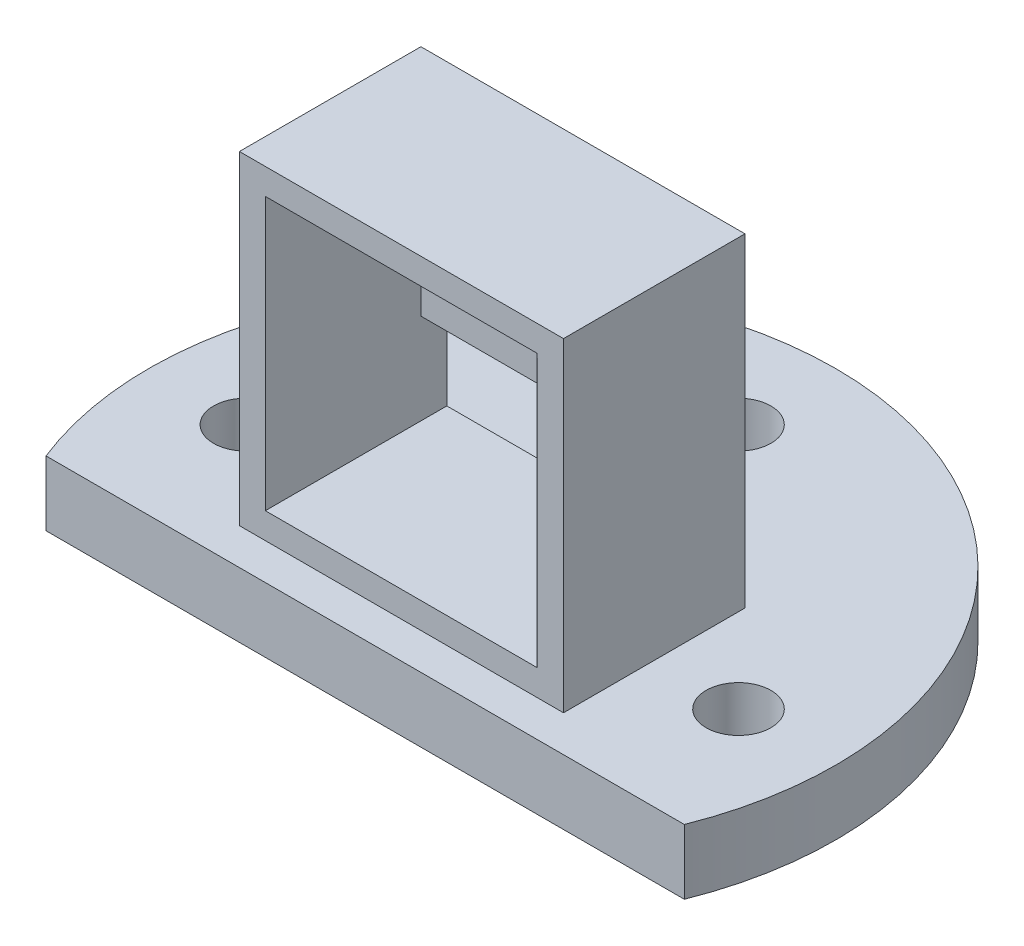
ISO-10303-21;
HEADER;
FILE_DESCRIPTION(('STEP AP214'),'2;1');
FILE_NAME('part.step','',(''),(''),'','','');
FILE_SCHEMA(('AUTOMOTIVE_DESIGN { 1 0 10303 214 1 1 1 1 }'));
ENDSEC;
DATA;
#1=APPLICATION_CONTEXT('core data for automotive mechanical design processes');
#2=APPLICATION_PROTOCOL_DEFINITION('international standard','automotive_design',2000,#1);
#3=PRODUCT_CONTEXT('',#1,'mechanical');
#4=PRODUCT('Part','Part','',(#3));
#5=PRODUCT_RELATED_PRODUCT_CATEGORY('part','',(#4));
#6=PRODUCT_DEFINITION_FORMATION('','',#4);
#7=PRODUCT_DEFINITION_CONTEXT('part definition',#1,'design');
#8=PRODUCT_DEFINITION('design','',#6,#7);
#9=PRODUCT_DEFINITION_SHAPE('','',#8);
#10=(LENGTH_UNIT() NAMED_UNIT(*) SI_UNIT(.MILLI.,.METRE.));
#11=(NAMED_UNIT(*) PLANE_ANGLE_UNIT() SI_UNIT($,.RADIAN.));
#12=(NAMED_UNIT(*) SI_UNIT($,.STERADIAN.) SOLID_ANGLE_UNIT());
#13=UNCERTAINTY_MEASURE_WITH_UNIT(LENGTH_MEASURE(1.E-05),#10,'distance_accuracy_value','');
#14=(GEOMETRIC_REPRESENTATION_CONTEXT(3) GLOBAL_UNCERTAINTY_ASSIGNED_CONTEXT((#13)) GLOBAL_UNIT_ASSIGNED_CONTEXT((#10,
#11,#12)) REPRESENTATION_CONTEXT('',''));
#15=CARTESIAN_POINT('',(0.,0.,0.));
#16=DIRECTION('',(0.,0.,1.));
#17=DIRECTION('',(1.,0.,0.));
#18=AXIS2_PLACEMENT_3D('',#15,#16,#17);
#19=CARTESIAN_POINT('',(-21.,56.,-10.));
#20=DIRECTION('',(0.,-1.,0.));
#21=DIRECTION('',(0.,0.,-1.));
#22=AXIS2_PLACEMENT_3D('',#19,#20,#21);
#23=PLANE('',#22);
#24=DIRECTION('',(1.,0.,0.));
#25=VECTOR('',#24,1.);
#26=CARTESIAN_POINT('',(-21.,56.,-10.));
#27=LINE('',#26,#25);
#28=CARTESIAN_POINT('',(20.8928650879154,56.,-10.));
#29=VERTEX_POINT('',#28);
#30=CARTESIAN_POINT('',(21.,56.,-10.));
#31=VERTEX_POINT('',#30);
#32=EDGE_CURVE('E84',#29,#31,#27,.T.);
#33=ORIENTED_EDGE('',*,*,#32,.F.);
#34=DIRECTION('',(0.,0.,1.));
#35=VECTOR('',#34,1.);
#36=CARTESIAN_POINT('',(20.8928650879154,56.,-10.));
#37=LINE('',#36,#35);
#38=CARTESIAN_POINT('',(20.8928650879154,56.,14.));
#39=VERTEX_POINT('',#38);
#40=EDGE_CURVE('E94',#29,#39,#37,.T.);
#41=ORIENTED_EDGE('',*,*,#40,.T.);
#42=DIRECTION('',(1.,0.,0.));
#43=VECTOR('',#42,1.);
#44=CARTESIAN_POINT('',(-21.,56.,14.));
#45=LINE('',#44,#43);
#46=CARTESIAN_POINT('',(21.,56.,14.));
#47=VERTEX_POINT('',#46);
#48=EDGE_CURVE('E92',#39,#47,#45,.T.);
#49=ORIENTED_EDGE('',*,*,#48,.T.);
#50=DIRECTION('',(0.,0.,1.));
#51=VECTOR('',#50,1.);
#52=CARTESIAN_POINT('',(21.,56.,-10.));
#53=LINE('',#52,#51);
#54=EDGE_CURVE('E12',#31,#47,#53,.T.);
#55=ORIENTED_EDGE('',*,*,#54,.F.);
#56=EDGE_LOOP('',(#33,#41,#49,#55));
#57=FACE_BOUND('',#56,.T.);
#58=ADVANCED_FACE('F42',(#57),#23,.F.);
#59=CARTESIAN_POINT('',(21.,14.,-10.));
#60=DIRECTION('',(1.,0.,0.));
#61=DIRECTION('',(0.,0.,-1.));
#62=AXIS2_PLACEMENT_3D('',#59,#60,#61);
#63=PLANE('',#62);
#64=DIRECTION('',(0.,1.,0.));
#65=VECTOR('',#64,1.);
#66=CARTESIAN_POINT('',(21.,14.,14.));
#67=LINE('',#66,#65);
#68=CARTESIAN_POINT('',(21.,14.,14.));
#69=VERTEX_POINT('',#68);
#70=EDGE_CURVE('E82',#69,#47,#67,.T.);
#71=ORIENTED_EDGE('',*,*,#70,.F.);
#72=DIRECTION('',(0.,0.,1.));
#73=VECTOR('',#72,1.);
#74=CARTESIAN_POINT('',(21.,14.,-10.));
#75=LINE('',#74,#73);
#76=CARTESIAN_POINT('',(21.,14.,-10.));
#77=VERTEX_POINT('',#76);
#78=EDGE_CURVE('E49',#77,#69,#75,.T.);
#79=ORIENTED_EDGE('',*,*,#78,.F.);
#80=DIRECTION('',(0.,1.,0.));
#81=VECTOR('',#80,1.);
#82=CARTESIAN_POINT('',(21.,14.,-10.));
#83=LINE('',#82,#81);
#84=EDGE_CURVE('E98',#77,#31,#83,.T.);
#85=ORIENTED_EDGE('',*,*,#84,.T.);
#86=ORIENTED_EDGE('',*,*,#54,.T.);
#87=EDGE_LOOP('',(#71,#79,#85,#86));
#88=FACE_BOUND('',#87,.T.);
#89=ADVANCED_FACE('F90',(#88),#63,.T.);
#90=CARTESIAN_POINT('',(-21.,14.,-10.));
#91=DIRECTION('',(0.,-1.,0.));
#92=DIRECTION('',(0.,0.,-1.));
#93=AXIS2_PLACEMENT_3D('',#90,#91,#92);
#94=PLANE('',#93);
#95=DIRECTION('',(0.,0.,1.));
#96=VECTOR('',#95,1.);
#97=CARTESIAN_POINT('',(20.8928650879154,14.,-10.));
#98=LINE('',#97,#96);
#99=CARTESIAN_POINT('',(20.8928650879154,14.,-10.));
#100=VERTEX_POINT('',#99);
#101=CARTESIAN_POINT('',(20.8928650879154,14.,14.));
#102=VERTEX_POINT('',#101);
#103=EDGE_CURVE('E56',#100,#102,#98,.T.);
#104=ORIENTED_EDGE('',*,*,#103,.F.);
#105=DIRECTION('',(1.,0.,0.));
#106=VECTOR('',#105,1.);
#107=CARTESIAN_POINT('',(-21.,14.,-10.));
#108=LINE('',#107,#106);
#109=EDGE_CURVE('E64',#100,#77,#108,.T.);
#110=ORIENTED_EDGE('',*,*,#109,.T.);
#111=ORIENTED_EDGE('',*,*,#78,.T.);
#112=DIRECTION('',(1.,0.,0.));
#113=VECTOR('',#112,1.);
#114=CARTESIAN_POINT('',(-21.,14.,14.));
#115=LINE('',#114,#113);
#116=EDGE_CURVE('E78',#102,#69,#115,.T.);
#117=ORIENTED_EDGE('',*,*,#116,.F.);
#118=EDGE_LOOP('',(#104,#110,#111,#117));
#119=FACE_BOUND('',#118,.T.);
#120=ADVANCED_FACE('F86',(#119),#94,.T.);
#121=CARTESIAN_POINT('',(0.,0.,-10.));
#122=DIRECTION('',(0.,0.,1.));
#123=DIRECTION('',(1.,0.,0.));
#124=AXIS2_PLACEMENT_3D('',#121,#122,#123);
#125=PLANE('',#124);
#126=ORIENTED_EDGE('',*,*,#109,.F.);
#127=DIRECTION('',(0.,1.,0.));
#128=VECTOR('',#127,1.);
#129=CARTESIAN_POINT('',(20.8928650879154,56.,-10.));
#130=LINE('',#129,#128);
#131=EDGE_CURVE('E102',#100,#29,#130,.T.);
#132=ORIENTED_EDGE('',*,*,#131,.T.);
#133=ORIENTED_EDGE('',*,*,#32,.T.);
#134=ORIENTED_EDGE('',*,*,#84,.F.);
#135=EDGE_LOOP('',(#126,#132,#133,#134));
#136=FACE_BOUND('',#135,.T.);
#137=ADVANCED_FACE('F109',(#136),#125,.F.);
#138=CARTESIAN_POINT('',(0.,0.,14.));
#139=DIRECTION('',(0.,0.,1.));
#140=DIRECTION('',(1.,0.,0.));
#141=AXIS2_PLACEMENT_3D('',#138,#139,#140);
#142=PLANE('',#141);
#143=DIRECTION('',(0.,1.,0.));
#144=VECTOR('',#143,1.);
#145=CARTESIAN_POINT('',(20.8928650879154,56.,14.));
#146=LINE('',#145,#144);
#147=EDGE_CURVE('E83',#102,#39,#146,.T.);
#148=ORIENTED_EDGE('',*,*,#147,.F.);
#149=ORIENTED_EDGE('',*,*,#116,.T.);
#150=ORIENTED_EDGE('',*,*,#70,.T.);
#151=ORIENTED_EDGE('',*,*,#48,.F.);
#152=EDGE_LOOP('',(#148,#149,#150,#151));
#153=FACE_BOUND('',#152,.T.);
#154=ADVANCED_FACE('F79',(#153),#142,.T.);
#155=CARTESIAN_POINT('',(20.8928650879154,56.,-10.));
#156=DIRECTION('',(1.,0.,0.));
#157=DIRECTION('',(0.,1.,0.));
#158=AXIS2_PLACEMENT_3D('',#155,#156,#157);
#159=PLANE('',#158);
#160=ORIENTED_EDGE('',*,*,#147,.T.);
#161=ORIENTED_EDGE('',*,*,#40,.F.);
#162=ORIENTED_EDGE('',*,*,#131,.F.);
#163=ORIENTED_EDGE('',*,*,#103,.T.);
#164=EDGE_LOOP('',(#160,#161,#162,#163));
#165=FACE_BOUND('',#164,.T.);
#166=ADVANCED_FACE('F113',(#165),#159,.F.);
#167=CLOSED_SHELL('',(#58,#89,#120,#137,#154,#166));
#168=MANIFOLD_SOLID_BREP('B2',#167);
#169=CARTESIAN_POINT('',(0.,10.,0.));
#170=DIRECTION('',(0.,1.,0.));
#171=DIRECTION('',(0.,0.,1.));
#172=AXIS2_PLACEMENT_3D('',#169,#170,#171);
#173=PLANE('',#172);
#174=DIRECTION('',(1.,0.,0.));
#175=VECTOR('',#174,1.);
#176=CARTESIAN_POINT('',(-25.,10.,-14.));
#177=LINE('',#176,#175);
#178=CARTESIAN_POINT('',(-25.,10.,-14.));
#179=VERTEX_POINT('',#178);
#180=CARTESIAN_POINT('',(25.,10.,-14.));
#181=VERTEX_POINT('',#180);
#182=EDGE_CURVE('E330',#179,#181,#177,.T.);
#183=ORIENTED_EDGE('',*,*,#182,.T.);
#184=DIRECTION('',(0.,0.,-1.));
#185=VECTOR('',#184,1.);
#186=CARTESIAN_POINT('',(25.,10.,14.));
#187=LINE('',#186,#185);
#188=CARTESIAN_POINT('',(25.,10.,14.));
#189=VERTEX_POINT('',#188);
#190=EDGE_CURVE('E348',#189,#181,#187,.T.);
#191=ORIENTED_EDGE('',*,*,#190,.F.);
#192=DIRECTION('',(1.,0.,0.));
#193=VECTOR('',#192,1.);
#194=CARTESIAN_POINT('',(-25.,10.,14.));
#195=LINE('',#194,#193);
#196=CARTESIAN_POINT('',(-25.,10.,14.));
#197=VERTEX_POINT('',#196);
#198=EDGE_CURVE('E351',#197,#189,#195,.T.);
#199=ORIENTED_EDGE('',*,*,#198,.F.);
#200=DIRECTION('',(0.,0.,-1.));
#201=VECTOR('',#200,1.);
#202=CARTESIAN_POINT('',(-25.,10.,14.));
#203=LINE('',#202,#201);
#204=EDGE_CURVE('E338',#197,#179,#203,.T.);
#205=ORIENTED_EDGE('',*,*,#204,.T.);
#206=EDGE_LOOP('',(#183,#191,#199,#205));
#207=FACE_BOUND('',#206,.T.);
#208=CARTESIAN_POINT('',(38.,10.,0.));
#209=DIRECTION('',(0.,1.,0.));
#210=DIRECTION('',(0.,0.,1.));
#211=AXIS2_PLACEMENT_3D('',#208,#209,#210);
#212=CIRCLE('',#211,5.);
#213=CARTESIAN_POINT('',(38.,10.,5.));
#214=VERTEX_POINT('',#213);
#215=EDGE_CURVE('E370',#214,#214,#212,.T.);
#216=ORIENTED_EDGE('',*,*,#215,.F.);
#217=EDGE_LOOP('',(#216));
#218=FACE_BOUND('',#217,.T.);
#219=CARTESIAN_POINT('',(0.,10.,0.));
#220=DIRECTION('',(0.,1.,0.));
#221=DIRECTION('',(0.,0.,1.));
#222=AXIS2_PLACEMENT_3D('',#219,#220,#221);
#223=CIRCLE('',#222,53.);
#224=CARTESIAN_POINT('',(49.2428543082641,10.,19.5995229425382));
#225=VERTEX_POINT('',#224);
#226=CARTESIAN_POINT('',(-49.2428543082641,10.,19.5995229425382));
#227=VERTEX_POINT('',#226);
#228=EDGE_CURVE('E382',#225,#227,#223,.T.);
#229=ORIENTED_EDGE('',*,*,#228,.T.);
#230=DIRECTION('',(1.,0.,0.));
#231=VECTOR('',#230,1.);
#232=CARTESIAN_POINT('',(-49.2428543082641,10.,19.5995229425382));
#233=LINE('',#232,#231);
#234=EDGE_CURVE('E385',#227,#225,#233,.T.);
#235=ORIENTED_EDGE('',*,*,#234,.T.);
#236=EDGE_LOOP('',(#229,#235));
#237=FACE_BOUND('',#236,.T.);
#238=CARTESIAN_POINT('',(-38.,10.,0.));
#239=DIRECTION('',(0.,1.,0.));
#240=DIRECTION('',(0.,0.,1.));
#241=AXIS2_PLACEMENT_3D('',#238,#239,#240);
#242=CIRCLE('',#241,5.);
#243=CARTESIAN_POINT('',(-38.,10.,5.));
#244=VERTEX_POINT('',#243);
#245=EDGE_CURVE('E376',#244,#244,#242,.T.);
#246=ORIENTED_EDGE('',*,*,#245,.F.);
#247=EDGE_LOOP('',(#246));
#248=FACE_BOUND('',#247,.T.);
#249=CARTESIAN_POINT('',(0.,10.,-38.));
#250=DIRECTION('',(0.,1.,0.));
#251=DIRECTION('',(0.,0.,1.));
#252=AXIS2_PLACEMENT_3D('',#249,#250,#251);
#253=CIRCLE('',#252,5.);
#254=CARTESIAN_POINT('',(0.,10.,-33.));
#255=VERTEX_POINT('',#254);
#256=EDGE_CURVE('E364',#255,#255,#253,.T.);
#257=ORIENTED_EDGE('',*,*,#256,.F.);
#258=EDGE_LOOP('',(#257));
#259=FACE_BOUND('',#258,.T.);
#260=ADVANCED_FACE('F162',(#207,#218,#237,#248,#259),#173,.T.);
#261=CARTESIAN_POINT('',(0.,0.,0.));
#262=DIRECTION('',(0.,1.,0.));
#263=DIRECTION('',(0.,0.,1.));
#264=AXIS2_PLACEMENT_3D('',#261,#262,#263);
#265=PLANE('',#264);
#266=CARTESIAN_POINT('',(0.,0.,0.));
#267=DIRECTION('',(0.,1.,0.));
#268=DIRECTION('',(0.,0.,1.));
#269=AXIS2_PLACEMENT_3D('',#266,#267,#268);
#270=CIRCLE('',#269,53.);
#271=CARTESIAN_POINT('',(49.2428543082641,0.,19.5995229425382));
#272=VERTEX_POINT('',#271);
#273=CARTESIAN_POINT('',(-49.2428543082641,0.,19.5995229425382));
#274=VERTEX_POINT('',#273);
#275=EDGE_CURVE('E379',#272,#274,#270,.T.);
#276=ORIENTED_EDGE('',*,*,#275,.F.);
#277=DIRECTION('',(1.,0.,0.));
#278=VECTOR('',#277,1.);
#279=CARTESIAN_POINT('',(-49.2428543082641,0.,19.5995229425382));
#280=LINE('',#279,#278);
#281=EDGE_CURVE('E386',#274,#272,#280,.T.);
#282=ORIENTED_EDGE('',*,*,#281,.F.);
#283=EDGE_LOOP('',(#276,#282));
#284=FACE_BOUND('',#283,.T.);
#285=CARTESIAN_POINT('',(-38.,0.,0.));
#286=DIRECTION('',(0.,1.,0.));
#287=DIRECTION('',(0.,0.,1.));
#288=AXIS2_PLACEMENT_3D('',#285,#286,#287);
#289=CIRCLE('',#288,5.);
#290=CARTESIAN_POINT('',(-38.,0.,5.));
#291=VERTEX_POINT('',#290);
#292=EDGE_CURVE('E373',#291,#291,#289,.T.);
#293=ORIENTED_EDGE('',*,*,#292,.T.);
#294=EDGE_LOOP('',(#293));
#295=FACE_BOUND('',#294,.T.);
#296=CARTESIAN_POINT('',(38.,0.,0.));
#297=DIRECTION('',(0.,1.,0.));
#298=DIRECTION('',(0.,0.,1.));
#299=AXIS2_PLACEMENT_3D('',#296,#297,#298);
#300=CIRCLE('',#299,5.);
#301=CARTESIAN_POINT('',(38.,0.,5.));
#302=VERTEX_POINT('',#301);
#303=EDGE_CURVE('E367',#302,#302,#300,.T.);
#304=ORIENTED_EDGE('',*,*,#303,.T.);
#305=EDGE_LOOP('',(#304));
#306=FACE_BOUND('',#305,.T.);
#307=CARTESIAN_POINT('',(0.,0.,-38.));
#308=DIRECTION('',(0.,1.,0.));
#309=DIRECTION('',(0.,0.,1.));
#310=AXIS2_PLACEMENT_3D('',#307,#308,#309);
#311=CIRCLE('',#310,5.);
#312=CARTESIAN_POINT('',(0.,0.,-33.));
#313=VERTEX_POINT('',#312);
#314=EDGE_CURVE('E358',#313,#313,#311,.T.);
#315=ORIENTED_EDGE('',*,*,#314,.T.);
#316=EDGE_LOOP('',(#315));
#317=FACE_BOUND('',#316,.T.);
#318=ADVANCED_FACE('F398',(#284,#295,#306,#317),#265,.F.);
#319=CARTESIAN_POINT('',(0.,10.,0.));
#320=DIRECTION('',(0.,-1.,0.));
#321=DIRECTION('',(0.,0.,-1.));
#322=AXIS2_PLACEMENT_3D('',#319,#320,#321);
#323=CYLINDRICAL_SURFACE('',#322,53.);
#324=ORIENTED_EDGE('',*,*,#275,.T.);
#325=DIRECTION('',(0.,-1.,0.));
#326=VECTOR('',#325,1.);
#327=CARTESIAN_POINT('',(-49.2428543082641,10.,19.5995229425382));
#328=LINE('',#327,#326);
#329=EDGE_CURVE('E40',#227,#274,#328,.T.);
#330=ORIENTED_EDGE('',*,*,#329,.F.);
#331=ORIENTED_EDGE('',*,*,#228,.F.);
#332=DIRECTION('',(0.,-1.,0.));
#333=VECTOR('',#332,1.);
#334=CARTESIAN_POINT('',(49.2428543082641,10.,19.5995229425382));
#335=LINE('',#334,#333);
#336=EDGE_CURVE('E170',#225,#272,#335,.T.);
#337=ORIENTED_EDGE('',*,*,#336,.T.);
#338=EDGE_LOOP('',(#324,#330,#331,#337));
#339=FACE_BOUND('',#338,.T.);
#340=ADVANCED_FACE('F164',(#339),#323,.T.);
#341=CARTESIAN_POINT('',(-49.2428543082641,10.,19.5995229425382));
#342=DIRECTION('',(0.,0.,-1.));
#343=DIRECTION('',(-1.,0.,0.));
#344=AXIS2_PLACEMENT_3D('',#341,#342,#343);
#345=PLANE('',#344);
#346=ORIENTED_EDGE('',*,*,#281,.T.);
#347=ORIENTED_EDGE('',*,*,#336,.F.);
#348=ORIENTED_EDGE('',*,*,#234,.F.);
#349=ORIENTED_EDGE('',*,*,#329,.T.);
#350=EDGE_LOOP('',(#346,#347,#348,#349));
#351=FACE_BOUND('',#350,.T.);
#352=ADVANCED_FACE('F400',(#351),#345,.F.);
#353=CARTESIAN_POINT('',(-38.,10.,0.));
#354=DIRECTION('',(0.,-1.,0.));
#355=DIRECTION('',(0.,0.,-1.));
#356=AXIS2_PLACEMENT_3D('',#353,#354,#355);
#357=CYLINDRICAL_SURFACE('',#356,5.);
#358=ORIENTED_EDGE('',*,*,#245,.T.);
#359=EDGE_LOOP('',(#358));
#360=FACE_BOUND('',#359,.T.);
#361=ORIENTED_EDGE('',*,*,#292,.F.);
#362=EDGE_LOOP('',(#361));
#363=FACE_BOUND('',#362,.T.);
#364=ADVANCED_FACE('F424',(#360,#363),#357,.F.);
#365=CARTESIAN_POINT('',(38.,10.,0.));
#366=DIRECTION('',(0.,-1.,0.));
#367=DIRECTION('',(0.,0.,-1.));
#368=AXIS2_PLACEMENT_3D('',#365,#366,#367);
#369=CYLINDRICAL_SURFACE('',#368,5.);
#370=ORIENTED_EDGE('',*,*,#215,.T.);
#371=EDGE_LOOP('',(#370));
#372=FACE_BOUND('',#371,.T.);
#373=ORIENTED_EDGE('',*,*,#303,.F.);
#374=EDGE_LOOP('',(#373));
#375=FACE_BOUND('',#374,.T.);
#376=ADVANCED_FACE('F413',(#372,#375),#369,.F.);
#377=CARTESIAN_POINT('',(0.,10.,-38.));
#378=DIRECTION('',(0.,-1.,0.));
#379=DIRECTION('',(0.,0.,-1.));
#380=AXIS2_PLACEMENT_3D('',#377,#378,#379);
#381=CYLINDRICAL_SURFACE('',#380,5.);
#382=ORIENTED_EDGE('',*,*,#256,.T.);
#383=EDGE_LOOP('',(#382));
#384=FACE_BOUND('',#383,.T.);
#385=ORIENTED_EDGE('',*,*,#314,.F.);
#386=EDGE_LOOP('',(#385));
#387=FACE_BOUND('',#386,.T.);
#388=ADVANCED_FACE('F410',(#384,#387),#381,.F.);
#389=CARTESIAN_POINT('',(-25.,60.,-14.));
#390=DIRECTION('',(0.,0.,-1.));
#391=DIRECTION('',(-1.,0.,0.));
#392=AXIS2_PLACEMENT_3D('',#389,#390,#391);
#393=PLANE('',#392);
#394=DIRECTION('',(0.,-1.,0.));
#395=VECTOR('',#394,1.);
#396=CARTESIAN_POINT('',(-21.,14.,-14.));
#397=LINE('',#396,#395);
#398=CARTESIAN_POINT('',(-21.,28.,-14.));
#399=VERTEX_POINT('',#398);
#400=CARTESIAN_POINT('',(-21.,14.,-14.));
#401=VERTEX_POINT('',#400);
#402=EDGE_CURVE('E268',#399,#401,#397,.T.);
#403=ORIENTED_EDGE('',*,*,#402,.T.);
#404=DIRECTION('',(1.,0.,0.));
#405=VECTOR('',#404,1.);
#406=CARTESIAN_POINT('',(-21.,14.,-14.));
#407=LINE('',#406,#405);
#408=CARTESIAN_POINT('',(20.8928650879154,14.,-14.));
#409=VERTEX_POINT('',#408);
#410=EDGE_CURVE('E276',#401,#409,#407,.T.);
#411=ORIENTED_EDGE('',*,*,#410,.T.);
#412=DIRECTION('',(0.,1.,0.));
#413=VECTOR('',#412,1.);
#414=CARTESIAN_POINT('',(20.8928650879154,14.,-14.));
#415=LINE('',#414,#413);
#416=CARTESIAN_POINT('',(20.8928650879154,28.,-14.));
#417=VERTEX_POINT('',#416);
#418=EDGE_CURVE('E280',#409,#417,#415,.T.);
#419=ORIENTED_EDGE('',*,*,#418,.T.);
#420=DIRECTION('',(-1.,0.,0.));
#421=VECTOR('',#420,1.);
#422=CARTESIAN_POINT('',(-21.,28.,-14.));
#423=LINE('',#422,#421);
#424=EDGE_CURVE('E285',#417,#399,#423,.T.);
#425=ORIENTED_EDGE('',*,*,#424,.T.);
#426=EDGE_LOOP('',(#403,#411,#419,#425));
#427=FACE_BOUND('',#426,.T.);
#428=DIRECTION('',(0.,-1.,0.));
#429=VECTOR('',#428,1.);
#430=CARTESIAN_POINT('',(-21.,44.,-14.));
#431=LINE('',#430,#429);
#432=CARTESIAN_POINT('',(-21.,56.,-14.));
#433=VERTEX_POINT('',#432);
#434=CARTESIAN_POINT('',(-21.,44.,-14.));
#435=VERTEX_POINT('',#434);
#436=EDGE_CURVE('E298',#433,#435,#431,.T.);
#437=ORIENTED_EDGE('',*,*,#436,.T.);
#438=DIRECTION('',(1.,0.,0.));
#439=VECTOR('',#438,1.);
#440=CARTESIAN_POINT('',(-21.,44.,-14.));
#441=LINE('',#440,#439);
#442=CARTESIAN_POINT('',(20.8928650879154,44.,-14.));
#443=VERTEX_POINT('',#442);
#444=EDGE_CURVE('E301',#435,#443,#441,.T.);
#445=ORIENTED_EDGE('',*,*,#444,.T.);
#446=DIRECTION('',(0.,1.,0.));
#447=VECTOR('',#446,1.);
#448=CARTESIAN_POINT('',(20.8928650879154,44.,-14.));
#449=LINE('',#448,#447);
#450=CARTESIAN_POINT('',(20.8928650879154,56.,-14.));
#451=VERTEX_POINT('',#450);
#452=EDGE_CURVE('E304',#443,#451,#449,.T.);
#453=ORIENTED_EDGE('',*,*,#452,.T.);
#454=DIRECTION('',(-1.,0.,0.));
#455=VECTOR('',#454,1.);
#456=CARTESIAN_POINT('',(-21.,56.,-14.));
#457=LINE('',#456,#455);
#458=EDGE_CURVE('E307',#451,#433,#457,.T.);
#459=ORIENTED_EDGE('',*,*,#458,.T.);
#460=EDGE_LOOP('',(#437,#445,#453,#459));
#461=FACE_BOUND('',#460,.T.);
#462=ORIENTED_EDGE('',*,*,#182,.F.);
#463=DIRECTION('',(0.,-1.,0.));
#464=VECTOR('',#463,1.);
#465=CARTESIAN_POINT('',(-25.,60.,-14.));
#466=LINE('',#465,#464);
#467=CARTESIAN_POINT('',(-25.,60.,-14.));
#468=VERTEX_POINT('',#467);
#469=EDGE_CURVE('E356',#468,#179,#466,.T.);
#470=ORIENTED_EDGE('',*,*,#469,.F.);
#471=DIRECTION('',(1.,0.,0.));
#472=VECTOR('',#471,1.);
#473=CARTESIAN_POINT('',(-25.,60.,-14.));
#474=LINE('',#473,#472);
#475=CARTESIAN_POINT('',(25.,60.,-14.));
#476=VERTEX_POINT('',#475);
#477=EDGE_CURVE('E334',#468,#476,#474,.T.);
#478=ORIENTED_EDGE('',*,*,#477,.T.);
#479=DIRECTION('',(0.,-1.,0.));
#480=VECTOR('',#479,1.);
#481=CARTESIAN_POINT('',(25.,60.,-14.));
#482=LINE('',#481,#480);
#483=EDGE_CURVE('E345',#476,#181,#482,.T.);
#484=ORIENTED_EDGE('',*,*,#483,.T.);
#485=EDGE_LOOP('',(#462,#470,#478,#484));
#486=FACE_BOUND('',#485,.T.);
#487=ADVANCED_FACE('F282',(#427,#461,#486),#393,.T.);
#488=CARTESIAN_POINT('',(-25.,60.,14.));
#489=DIRECTION('',(-1.,0.,0.));
#490=DIRECTION('',(0.,0.,1.));
#491=AXIS2_PLACEMENT_3D('',#488,#489,#490);
#492=PLANE('',#491);
#493=ORIENTED_EDGE('',*,*,#204,.F.);
#494=DIRECTION('',(0.,-1.,0.));
#495=VECTOR('',#494,1.);
#496=CARTESIAN_POINT('',(-25.,60.,14.));
#497=LINE('',#496,#495);
#498=CARTESIAN_POINT('',(-25.,60.,14.));
#499=VERTEX_POINT('',#498);
#500=EDGE_CURVE('E359',#499,#197,#497,.T.);
#501=ORIENTED_EDGE('',*,*,#500,.F.);
#502=DIRECTION('',(0.,0.,-1.));
#503=VECTOR('',#502,1.);
#504=CARTESIAN_POINT('',(-25.,60.,14.));
#505=LINE('',#504,#503);
#506=EDGE_CURVE('E342',#499,#468,#505,.T.);
#507=ORIENTED_EDGE('',*,*,#506,.T.);
#508=ORIENTED_EDGE('',*,*,#469,.T.);
#509=EDGE_LOOP('',(#493,#501,#507,#508));
#510=FACE_BOUND('',#509,.T.);
#511=ADVANCED_FACE('F438',(#510),#492,.T.);
#512=CARTESIAN_POINT('',(-25.,60.,14.));
#513=DIRECTION('',(0.,0.,-1.));
#514=DIRECTION('',(-1.,0.,0.));
#515=AXIS2_PLACEMENT_3D('',#512,#513,#514);
#516=PLANE('',#515);
#517=DIRECTION('',(1.,0.,0.));
#518=VECTOR('',#517,1.);
#519=CARTESIAN_POINT('',(-21.,14.,14.));
#520=LINE('',#519,#518);
#521=CARTESIAN_POINT('',(-21.,14.,14.));
#522=VERTEX_POINT('',#521);
#523=CARTESIAN_POINT('',(20.8928650879154,14.,14.));
#524=VERTEX_POINT('',#523);
#525=EDGE_CURVE('E321',#522,#524,#520,.T.);
#526=ORIENTED_EDGE('',*,*,#525,.F.);
#527=DIRECTION('',(0.,-1.,0.));
#528=VECTOR('',#527,1.);
#529=CARTESIAN_POINT('',(-21.,56.,14.));
#530=LINE('',#529,#528);
#531=CARTESIAN_POINT('',(-21.,56.,14.));
#532=VERTEX_POINT('',#531);
#533=EDGE_CURVE('E271',#532,#522,#530,.T.);
#534=ORIENTED_EDGE('',*,*,#533,.F.);
#535=DIRECTION('',(-1.,0.,0.));
#536=VECTOR('',#535,1.);
#537=CARTESIAN_POINT('',(-21.,56.,14.));
#538=LINE('',#537,#536);
#539=CARTESIAN_POINT('',(20.8928650879154,56.,14.));
#540=VERTEX_POINT('',#539);
#541=EDGE_CURVE('E318',#540,#532,#538,.T.);
#542=ORIENTED_EDGE('',*,*,#541,.F.);
#543=DIRECTION('',(0.,1.,0.));
#544=VECTOR('',#543,1.);
#545=CARTESIAN_POINT('',(20.8928650879154,56.,14.));
#546=LINE('',#545,#544);
#547=EDGE_CURVE('E323',#524,#540,#546,.T.);
#548=ORIENTED_EDGE('',*,*,#547,.F.);
#549=EDGE_LOOP('',(#526,#534,#542,#548));
#550=FACE_BOUND('',#549,.T.);
#551=ORIENTED_EDGE('',*,*,#198,.T.);
#552=DIRECTION('',(0.,-1.,0.));
#553=VECTOR('',#552,1.);
#554=CARTESIAN_POINT('',(25.,60.,14.));
#555=LINE('',#554,#553);
#556=CARTESIAN_POINT('',(25.,60.,14.));
#557=VERTEX_POINT('',#556);
#558=EDGE_CURVE('E361',#557,#189,#555,.T.);
#559=ORIENTED_EDGE('',*,*,#558,.F.);
#560=DIRECTION('',(1.,0.,0.));
#561=VECTOR('',#560,1.);
#562=CARTESIAN_POINT('',(-25.,60.,14.));
#563=LINE('',#562,#561);
#564=EDGE_CURVE('E340',#499,#557,#563,.T.);
#565=ORIENTED_EDGE('',*,*,#564,.F.);
#566=ORIENTED_EDGE('',*,*,#500,.T.);
#567=EDGE_LOOP('',(#551,#559,#565,#566));
#568=FACE_BOUND('',#567,.T.);
#569=ADVANCED_FACE('F443',(#550,#568),#516,.F.);
#570=CARTESIAN_POINT('',(25.,60.,14.));
#571=DIRECTION('',(-1.,0.,0.));
#572=DIRECTION('',(0.,0.,1.));
#573=AXIS2_PLACEMENT_3D('',#570,#571,#572);
#574=PLANE('',#573);
#575=ORIENTED_EDGE('',*,*,#190,.T.);
#576=ORIENTED_EDGE('',*,*,#483,.F.);
#577=DIRECTION('',(0.,0.,-1.));
#578=VECTOR('',#577,1.);
#579=CARTESIAN_POINT('',(25.,60.,14.));
#580=LINE('',#579,#578);
#581=EDGE_CURVE('E337',#557,#476,#580,.T.);
#582=ORIENTED_EDGE('',*,*,#581,.F.);
#583=ORIENTED_EDGE('',*,*,#558,.T.);
#584=EDGE_LOOP('',(#575,#576,#582,#583));
#585=FACE_BOUND('',#584,.T.);
#586=ADVANCED_FACE('F439',(#585),#574,.F.);
#587=CARTESIAN_POINT('',(0.,60.,0.));
#588=DIRECTION('',(0.,1.,0.));
#589=DIRECTION('',(0.,0.,1.));
#590=AXIS2_PLACEMENT_3D('',#587,#588,#589);
#591=PLANE('',#590);
#592=ORIENTED_EDGE('',*,*,#477,.F.);
#593=ORIENTED_EDGE('',*,*,#506,.F.);
#594=ORIENTED_EDGE('',*,*,#564,.T.);
#595=ORIENTED_EDGE('',*,*,#581,.T.);
#596=EDGE_LOOP('',(#592,#593,#594,#595));
#597=FACE_BOUND('',#596,.T.);
#598=ADVANCED_FACE('F442',(#597),#591,.T.);
#599=CARTESIAN_POINT('',(-21.,56.,-10.));
#600=DIRECTION('',(-1.,0.,0.));
#601=DIRECTION('',(0.,0.,1.));
#602=AXIS2_PLACEMENT_3D('',#599,#600,#601);
#603=PLANE('',#602);
#604=ORIENTED_EDGE('',*,*,#533,.T.);
#605=DIRECTION('',(0.,0.,1.));
#606=VECTOR('',#605,1.);
#607=CARTESIAN_POINT('',(-21.,14.,-10.));
#608=LINE('',#607,#606);
#609=EDGE_CURVE('E265',#401,#522,#608,.T.);
#610=ORIENTED_EDGE('',*,*,#609,.F.);
#611=ORIENTED_EDGE('',*,*,#402,.F.);
#612=DIRECTION('',(0.,0.,1.));
#613=VECTOR('',#612,1.);
#614=CARTESIAN_POINT('',(-21.,28.,-14.));
#615=LINE('',#614,#613);
#616=CARTESIAN_POINT('',(-21.,28.,-10.));
#617=VERTEX_POINT('',#616);
#618=EDGE_CURVE('E294',#399,#617,#615,.T.);
#619=ORIENTED_EDGE('',*,*,#618,.T.);
#620=DIRECTION('',(0.,-1.,0.));
#621=VECTOR('',#620,1.);
#622=CARTESIAN_POINT('',(-21.,56.,-10.));
#623=LINE('',#622,#621);
#624=CARTESIAN_POINT('',(-21.,44.,-10.));
#625=VERTEX_POINT('',#624);
#626=EDGE_CURVE('E315',#625,#617,#623,.T.);
#627=ORIENTED_EDGE('',*,*,#626,.F.);
#628=DIRECTION('',(0.,0.,1.));
#629=VECTOR('',#628,1.);
#630=CARTESIAN_POINT('',(-21.,44.,-14.));
#631=LINE('',#630,#629);
#632=EDGE_CURVE('E185',#435,#625,#631,.T.);
#633=ORIENTED_EDGE('',*,*,#632,.F.);
#634=ORIENTED_EDGE('',*,*,#436,.F.);
#635=DIRECTION('',(0.,0.,1.));
#636=VECTOR('',#635,1.);
#637=CARTESIAN_POINT('',(-21.,56.,-10.));
#638=LINE('',#637,#636);
#639=EDGE_CURVE('E328',#433,#532,#638,.T.);
#640=ORIENTED_EDGE('',*,*,#639,.T.);
#641=EDGE_LOOP('',(#604,#610,#611,#619,#627,#633,#634,#640));
#642=FACE_BOUND('',#641,.T.);
#643=ADVANCED_FACE('F266',(#642),#603,.F.);
#644=CARTESIAN_POINT('',(-21.,56.,-10.));
#645=DIRECTION('',(0.,1.,0.));
#646=DIRECTION('',(0.,0.,1.));
#647=AXIS2_PLACEMENT_3D('',#644,#645,#646);
#648=PLANE('',#647);
#649=ORIENTED_EDGE('',*,*,#541,.T.);
#650=ORIENTED_EDGE('',*,*,#639,.F.);
#651=ORIENTED_EDGE('',*,*,#458,.F.);
#652=DIRECTION('',(0.,0.,1.));
#653=VECTOR('',#652,1.);
#654=CARTESIAN_POINT('',(20.8928650879154,56.,-10.));
#655=LINE('',#654,#653);
#656=EDGE_CURVE('E331',#451,#540,#655,.T.);
#657=ORIENTED_EDGE('',*,*,#656,.T.);
#658=EDGE_LOOP('',(#649,#650,#651,#657));
#659=FACE_BOUND('',#658,.T.);
#660=ADVANCED_FACE('F456',(#659),#648,.F.);
#661=CARTESIAN_POINT('',(20.8928650879154,56.,-10.));
#662=DIRECTION('',(1.,0.,0.));
#663=DIRECTION('',(0.,1.,0.));
#664=AXIS2_PLACEMENT_3D('',#661,#662,#663);
#665=PLANE('',#664);
#666=ORIENTED_EDGE('',*,*,#547,.T.);
#667=ORIENTED_EDGE('',*,*,#656,.F.);
#668=ORIENTED_EDGE('',*,*,#452,.F.);
#669=DIRECTION('',(0.,0.,1.));
#670=VECTOR('',#669,1.);
#671=CARTESIAN_POINT('',(20.8928650879154,44.,-14.));
#672=LINE('',#671,#670);
#673=CARTESIAN_POINT('',(20.8928650879154,44.,-10.));
#674=VERTEX_POINT('',#673);
#675=EDGE_CURVE('E311',#443,#674,#672,.T.);
#676=ORIENTED_EDGE('',*,*,#675,.T.);
#677=DIRECTION('',(0.,1.,0.));
#678=VECTOR('',#677,1.);
#679=CARTESIAN_POINT('',(20.8928650879154,56.,-10.));
#680=LINE('',#679,#678);
#681=CARTESIAN_POINT('',(20.8928650879154,28.,-10.));
#682=VERTEX_POINT('',#681);
#683=EDGE_CURVE('E273',#682,#674,#680,.T.);
#684=ORIENTED_EDGE('',*,*,#683,.F.);
#685=DIRECTION('',(0.,0.,1.));
#686=VECTOR('',#685,1.);
#687=CARTESIAN_POINT('',(20.8928650879154,28.,-14.));
#688=LINE('',#687,#686);
#689=EDGE_CURVE('E292',#417,#682,#688,.T.);
#690=ORIENTED_EDGE('',*,*,#689,.F.);
#691=ORIENTED_EDGE('',*,*,#418,.F.);
#692=DIRECTION('',(0.,0.,1.));
#693=VECTOR('',#692,1.);
#694=CARTESIAN_POINT('',(20.8928650879154,14.,-10.));
#695=LINE('',#694,#693);
#696=EDGE_CURVE('E177',#409,#524,#695,.T.);
#697=ORIENTED_EDGE('',*,*,#696,.T.);
#698=EDGE_LOOP('',(#666,#667,#668,#676,#684,#690,#691,#697));
#699=FACE_BOUND('',#698,.T.);
#700=ADVANCED_FACE('F460',(#699),#665,.F.);
#701=CARTESIAN_POINT('',(-21.,14.,-10.));
#702=DIRECTION('',(0.,-1.,0.));
#703=DIRECTION('',(0.,0.,-1.));
#704=AXIS2_PLACEMENT_3D('',#701,#702,#703);
#705=PLANE('',#704);
#706=ORIENTED_EDGE('',*,*,#525,.T.);
#707=ORIENTED_EDGE('',*,*,#696,.F.);
#708=ORIENTED_EDGE('',*,*,#410,.F.);
#709=ORIENTED_EDGE('',*,*,#609,.T.);
#710=EDGE_LOOP('',(#706,#707,#708,#709));
#711=FACE_BOUND('',#710,.T.);
#712=ADVANCED_FACE('F277',(#711),#705,.F.);
#713=CARTESIAN_POINT('',(0.,0.,-10.));
#714=DIRECTION('',(0.,0.,1.));
#715=DIRECTION('',(1.,0.,0.));
#716=AXIS2_PLACEMENT_3D('',#713,#714,#715);
#717=PLANE('',#716);
#718=DIRECTION('',(-1.,0.,0.));
#719=VECTOR('',#718,1.);
#720=CARTESIAN_POINT('',(-21.,28.,-10.));
#721=LINE('',#720,#719);
#722=EDGE_CURVE('E286',#682,#617,#721,.T.);
#723=ORIENTED_EDGE('',*,*,#722,.F.);
#724=ORIENTED_EDGE('',*,*,#683,.T.);
#725=DIRECTION('',(1.,0.,0.));
#726=VECTOR('',#725,1.);
#727=CARTESIAN_POINT('',(-21.,44.,-10.));
#728=LINE('',#727,#726);
#729=EDGE_CURVE('E296',#625,#674,#728,.T.);
#730=ORIENTED_EDGE('',*,*,#729,.F.);
#731=ORIENTED_EDGE('',*,*,#626,.T.);
#732=EDGE_LOOP('',(#723,#724,#730,#731));
#733=FACE_BOUND('',#732,.T.);
#734=ADVANCED_FACE('F459',(#733),#717,.T.);
#735=CARTESIAN_POINT('',(-21.,44.,-14.));
#736=DIRECTION('',(0.,-1.,0.));
#737=DIRECTION('',(0.,0.,-1.));
#738=AXIS2_PLACEMENT_3D('',#735,#736,#737);
#739=PLANE('',#738);
#740=ORIENTED_EDGE('',*,*,#729,.T.);
#741=ORIENTED_EDGE('',*,*,#675,.F.);
#742=ORIENTED_EDGE('',*,*,#444,.F.);
#743=ORIENTED_EDGE('',*,*,#632,.T.);
#744=EDGE_LOOP('',(#740,#741,#742,#743));
#745=FACE_BOUND('',#744,.T.);
#746=ADVANCED_FACE('F469',(#745),#739,.F.);
#747=CARTESIAN_POINT('',(-21.,28.,-14.));
#748=DIRECTION('',(0.,1.,0.));
#749=DIRECTION('',(0.,0.,1.));
#750=AXIS2_PLACEMENT_3D('',#747,#748,#749);
#751=PLANE('',#750);
#752=ORIENTED_EDGE('',*,*,#722,.T.);
#753=ORIENTED_EDGE('',*,*,#618,.F.);
#754=ORIENTED_EDGE('',*,*,#424,.F.);
#755=ORIENTED_EDGE('',*,*,#689,.T.);
#756=EDGE_LOOP('',(#752,#753,#754,#755));
#757=FACE_BOUND('',#756,.T.);
#758=ADVANCED_FACE('F473',(#757),#751,.F.);
#759=CLOSED_SHELL('',(#260,#318,#340,#352,#364,#376,#388,#487,#511,#569,#586,#598,#643,#660,
#700,#712,#734,#746,#758));
#760=MANIFOLD_SOLID_BREP('B6',#759);
#761=ADVANCED_BREP_SHAPE_REPRESENTATION('',(#18,#168,#760),#14);
#762=SHAPE_DEFINITION_REPRESENTATION(#9,#761);
ENDSEC;
END-ISO-10303-21;
